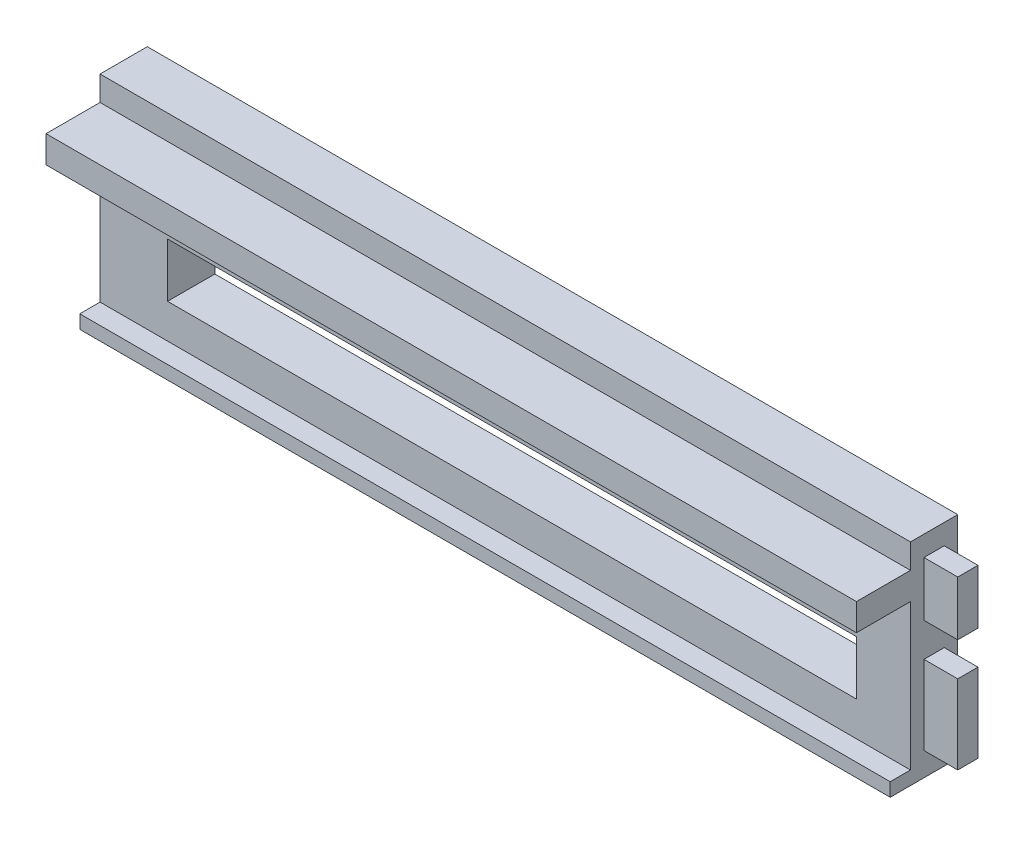
ISO-10303-21;
HEADER;
FILE_DESCRIPTION(('STEP AP214'),'2;1');
FILE_NAME('part.step','',(''),(''),'','','');
FILE_SCHEMA(('AUTOMOTIVE_DESIGN { 1 0 10303 214 1 1 1 1 }'));
ENDSEC;
DATA;
#1=APPLICATION_CONTEXT('core data for automotive mechanical design processes');
#2=APPLICATION_PROTOCOL_DEFINITION('international standard','automotive_design',2000,#1);
#3=PRODUCT_CONTEXT('',#1,'mechanical');
#4=PRODUCT('Part','Part','',(#3));
#5=PRODUCT_RELATED_PRODUCT_CATEGORY('part','',(#4));
#6=PRODUCT_DEFINITION_FORMATION('','',#4);
#7=PRODUCT_DEFINITION_CONTEXT('part definition',#1,'design');
#8=PRODUCT_DEFINITION('design','',#6,#7);
#9=PRODUCT_DEFINITION_SHAPE('','',#8);
#10=(LENGTH_UNIT() NAMED_UNIT(*) SI_UNIT(.MILLI.,.METRE.));
#11=(NAMED_UNIT(*) PLANE_ANGLE_UNIT() SI_UNIT($,.RADIAN.));
#12=(NAMED_UNIT(*) SI_UNIT($,.STERADIAN.) SOLID_ANGLE_UNIT());
#13=UNCERTAINTY_MEASURE_WITH_UNIT(LENGTH_MEASURE(1.E-05),#10,'distance_accuracy_value','');
#14=(GEOMETRIC_REPRESENTATION_CONTEXT(3) GLOBAL_UNCERTAINTY_ASSIGNED_CONTEXT((#13)) GLOBAL_UNIT_ASSIGNED_CONTEXT((#10,
#11,#12)) REPRESENTATION_CONTEXT('',''));
#15=CARTESIAN_POINT('',(0.,0.,0.));
#16=DIRECTION('',(0.,0.,1.));
#17=DIRECTION('',(1.,0.,0.));
#18=AXIS2_PLACEMENT_3D('',#15,#16,#17);
#19=CARTESIAN_POINT('',(120.,0.,7.));
#20=DIRECTION('',(-1.,0.,0.));
#21=DIRECTION('',(0.,0.,1.));
#22=AXIS2_PLACEMENT_3D('',#19,#20,#21);
#23=PLANE('',#22);
#24=DIRECTION('',(0.,-1.,0.));
#25=VECTOR('',#24,1.);
#26=CARTESIAN_POINT('',(120.,3.5,5.));
#27=LINE('',#26,#25);
#28=CARTESIAN_POINT('',(120.,15.1919851003935,5.));
#29=VERTEX_POINT('',#28);
#30=CARTESIAN_POINT('',(120.,3.5,5.));
#31=VERTEX_POINT('',#30);
#32=EDGE_CURVE('E328',#29,#31,#27,.T.);
#33=ORIENTED_EDGE('',*,*,#32,.F.);
#34=DIRECTION('',(0.,0.,1.));
#35=VECTOR('',#34,1.);
#36=CARTESIAN_POINT('',(120.,15.1919851003935,5.));
#37=LINE('',#36,#35);
#38=CARTESIAN_POINT('',(120.,15.1919851003935,2.));
#39=VERTEX_POINT('',#38);
#40=EDGE_CURVE('E317',#39,#29,#37,.T.);
#41=ORIENTED_EDGE('',*,*,#40,.F.);
#42=DIRECTION('',(0.,1.,0.));
#43=VECTOR('',#42,1.);
#44=CARTESIAN_POINT('',(120.,3.5,2.));
#45=LINE('',#44,#43);
#46=CARTESIAN_POINT('',(120.,3.5,2.));
#47=VERTEX_POINT('',#46);
#48=EDGE_CURVE('E318',#47,#39,#45,.T.);
#49=ORIENTED_EDGE('',*,*,#48,.F.);
#50=DIRECTION('',(0.,0.,-1.));
#51=VECTOR('',#50,1.);
#52=CARTESIAN_POINT('',(120.,3.5,5.));
#53=LINE('',#52,#51);
#54=EDGE_CURVE('E323',#31,#47,#53,.T.);
#55=ORIENTED_EDGE('',*,*,#54,.F.);
#56=EDGE_LOOP('',(#33,#41,#49,#55));
#57=FACE_BOUND('',#56,.T.);
#58=DIRECTION('',(0.,1.,0.));
#59=VECTOR('',#58,1.);
#60=CARTESIAN_POINT('',(120.,0.,10.));
#61=LINE('',#60,#59);
#62=CARTESIAN_POINT('',(120.,0.,10.));
#63=VERTEX_POINT('',#62);
#64=CARTESIAN_POINT('',(120.,2.,10.));
#65=VERTEX_POINT('',#64);
#66=EDGE_CURVE('E379',#63,#65,#61,.T.);
#67=ORIENTED_EDGE('',*,*,#66,.F.);
#68=DIRECTION('',(0.,0.,-1.));
#69=VECTOR('',#68,1.);
#70=CARTESIAN_POINT('',(120.,0.,7.));
#71=LINE('',#70,#69);
#72=CARTESIAN_POINT('',(120.,0.,0.));
#73=VERTEX_POINT('',#72);
#74=EDGE_CURVE('E53',#63,#73,#71,.T.);
#75=ORIENTED_EDGE('',*,*,#74,.T.);
#76=DIRECTION('',(0.,1.,0.));
#77=VECTOR('',#76,1.);
#78=CARTESIAN_POINT('',(120.,0.,0.));
#79=LINE('',#78,#77);
#80=CARTESIAN_POINT('',(120.,31.25,0.));
#81=VERTEX_POINT('',#80);
#82=EDGE_CURVE('E596',#73,#81,#79,.T.);
#83=ORIENTED_EDGE('',*,*,#82,.T.);
#84=DIRECTION('',(0.,0.,-1.));
#85=VECTOR('',#84,1.);
#86=CARTESIAN_POINT('',(120.,31.25,7.));
#87=LINE('',#86,#85);
#88=CARTESIAN_POINT('',(120.,31.25,7.));
#89=VERTEX_POINT('',#88);
#90=EDGE_CURVE('E610',#89,#81,#87,.T.);
#91=ORIENTED_EDGE('',*,*,#90,.F.);
#92=DIRECTION('',(0.,1.,0.));
#93=VECTOR('',#92,1.);
#94=CARTESIAN_POINT('',(120.,0.,7.));
#95=LINE('',#94,#93);
#96=CARTESIAN_POINT('',(120.,27.6,7.));
#97=VERTEX_POINT('',#96);
#98=EDGE_CURVE('E585',#97,#89,#95,.T.);
#99=ORIENTED_EDGE('',*,*,#98,.F.);
#100=DIRECTION('',(0.,0.,-1.));
#101=VECTOR('',#100,1.);
#102=CARTESIAN_POINT('',(120.,27.6,15.));
#103=LINE('',#102,#101);
#104=CARTESIAN_POINT('',(120.,27.6,15.));
#105=VERTEX_POINT('',#104);
#106=EDGE_CURVE('E560',#105,#97,#103,.T.);
#107=ORIENTED_EDGE('',*,*,#106,.F.);
#108=DIRECTION('',(0.,1.,0.));
#109=VECTOR('',#108,1.);
#110=CARTESIAN_POINT('',(120.,27.6,15.));
#111=LINE('',#110,#109);
#112=CARTESIAN_POINT('',(120.,23.6,15.));
#113=VERTEX_POINT('',#112);
#114=EDGE_CURVE('E536',#113,#105,#111,.T.);
#115=ORIENTED_EDGE('',*,*,#114,.F.);
#116=DIRECTION('',(0.,0.,-1.));
#117=VECTOR('',#116,1.);
#118=CARTESIAN_POINT('',(120.,23.6,15.));
#119=LINE('',#118,#117);
#120=CARTESIAN_POINT('',(120.,23.6,7.));
#121=VERTEX_POINT('',#120);
#122=EDGE_CURVE('E561',#113,#121,#119,.T.);
#123=ORIENTED_EDGE('',*,*,#122,.T.);
#124=CARTESIAN_POINT('',(120.,2.,7.));
#125=VERTEX_POINT('',#124);
#126=EDGE_CURVE('E586',#125,#121,#95,.T.);
#127=ORIENTED_EDGE('',*,*,#126,.F.);
#128=DIRECTION('',(0.,0.,-1.));
#129=VECTOR('',#128,1.);
#130=CARTESIAN_POINT('',(120.,2.,15.));
#131=LINE('',#130,#129);
#132=EDGE_CURVE('E528',#65,#125,#131,.T.);
#133=ORIENTED_EDGE('',*,*,#132,.F.);
#134=EDGE_LOOP('',(#67,#75,#83,#91,#99,#107,#115,#123,#127,#133));
#135=FACE_BOUND('',#134,.T.);
#136=DIRECTION('',(0.,-1.,0.));
#137=VECTOR('',#136,1.);
#138=CARTESIAN_POINT('',(120.,20.1919851003935,5.));
#139=LINE('',#138,#137);
#140=CARTESIAN_POINT('',(120.,28.25,5.));
#141=VERTEX_POINT('',#140);
#142=CARTESIAN_POINT('',(120.,20.1919851003935,5.));
#143=VERTEX_POINT('',#142);
#144=EDGE_CURVE('E62',#141,#143,#139,.T.);
#145=ORIENTED_EDGE('',*,*,#144,.F.);
#146=DIRECTION('',(0.,0.,1.));
#147=VECTOR('',#146,1.);
#148=CARTESIAN_POINT('',(120.,28.25,5.));
#149=LINE('',#148,#147);
#150=CARTESIAN_POINT('',(120.,28.25,2.));
#151=VERTEX_POINT('',#150);
#152=EDGE_CURVE('E63',#151,#141,#149,.T.);
#153=ORIENTED_EDGE('',*,*,#152,.F.);
#154=DIRECTION('',(0.,1.,0.));
#155=VECTOR('',#154,1.);
#156=CARTESIAN_POINT('',(120.,20.1919851003935,2.));
#157=LINE('',#156,#155);
#158=CARTESIAN_POINT('',(120.,20.1919851003935,2.));
#159=VERTEX_POINT('',#158);
#160=EDGE_CURVE('E1022',#159,#151,#157,.T.);
#161=ORIENTED_EDGE('',*,*,#160,.F.);
#162=DIRECTION('',(0.,0.,-1.));
#163=VECTOR('',#162,1.);
#164=CARTESIAN_POINT('',(120.,20.1919851003935,5.));
#165=LINE('',#164,#163);
#166=EDGE_CURVE('E1031',#143,#159,#165,.T.);
#167=ORIENTED_EDGE('',*,*,#166,.F.);
#168=EDGE_LOOP('',(#145,#153,#161,#167));
#169=FACE_BOUND('',#168,.T.);
#170=ADVANCED_FACE('F44',(#57,#135,#169),#23,.F.);
#171=CARTESIAN_POINT('',(0.,0.,7.));
#172=DIRECTION('',(1.,0.,0.));
#173=DIRECTION('',(0.,0.,-1.));
#174=AXIS2_PLACEMENT_3D('',#171,#172,#173);
#175=PLANE('',#174);
#176=DIRECTION('',(0.,0.,1.));
#177=VECTOR('',#176,1.);
#178=CARTESIAN_POINT('',(0.,20.1593881752143,2.));
#179=LINE('',#178,#177);
#180=CARTESIAN_POINT('',(0.,20.1593881752143,2.));
#181=VERTEX_POINT('',#180);
#182=CARTESIAN_POINT('',(0.,20.1593881752143,5.));
#183=VERTEX_POINT('',#182);
#184=EDGE_CURVE('E362',#181,#183,#179,.T.);
#185=ORIENTED_EDGE('',*,*,#184,.F.);
#186=DIRECTION('',(0.,-1.,0.));
#187=VECTOR('',#186,1.);
#188=CARTESIAN_POINT('',(0.,20.1593881752143,2.));
#189=LINE('',#188,#187);
#190=CARTESIAN_POINT('',(0.,28.25,2.));
#191=VERTEX_POINT('',#190);
#192=EDGE_CURVE('E365',#191,#181,#189,.T.);
#193=ORIENTED_EDGE('',*,*,#192,.F.);
#194=DIRECTION('',(0.,0.,-1.));
#195=VECTOR('',#194,1.);
#196=CARTESIAN_POINT('',(0.,28.25,2.));
#197=LINE('',#196,#195);
#198=CARTESIAN_POINT('',(0.,28.25,5.));
#199=VERTEX_POINT('',#198);
#200=EDGE_CURVE('E348',#199,#191,#197,.T.);
#201=ORIENTED_EDGE('',*,*,#200,.F.);
#202=DIRECTION('',(0.,1.,0.));
#203=VECTOR('',#202,1.);
#204=CARTESIAN_POINT('',(0.,20.1593881752143,5.));
#205=LINE('',#204,#203);
#206=EDGE_CURVE('E369',#183,#199,#205,.T.);
#207=ORIENTED_EDGE('',*,*,#206,.F.);
#208=EDGE_LOOP('',(#185,#193,#201,#207));
#209=FACE_BOUND('',#208,.T.);
#210=DIRECTION('',(0.,0.,1.));
#211=VECTOR('',#210,1.);
#212=CARTESIAN_POINT('',(0.,3.5,2.));
#213=LINE('',#212,#211);
#214=CARTESIAN_POINT('',(0.,3.5,2.));
#215=VERTEX_POINT('',#214);
#216=CARTESIAN_POINT('',(0.,3.5,5.));
#217=VERTEX_POINT('',#216);
#218=EDGE_CURVE('E406',#215,#217,#213,.T.);
#219=ORIENTED_EDGE('',*,*,#218,.F.);
#220=DIRECTION('',(0.,-1.,0.));
#221=VECTOR('',#220,1.);
#222=CARTESIAN_POINT('',(0.,3.5,2.));
#223=LINE('',#222,#221);
#224=CARTESIAN_POINT('',(0.,14.1593881752143,2.));
#225=VERTEX_POINT('',#224);
#226=EDGE_CURVE('E366',#225,#215,#223,.T.);
#227=ORIENTED_EDGE('',*,*,#226,.F.);
#228=DIRECTION('',(0.,0.,-1.));
#229=VECTOR('',#228,1.);
#230=CARTESIAN_POINT('',(0.,14.1593881752143,2.));
#231=LINE('',#230,#229);
#232=CARTESIAN_POINT('',(0.,14.1593881752143,5.));
#233=VERTEX_POINT('',#232);
#234=EDGE_CURVE('E398',#233,#225,#231,.T.);
#235=ORIENTED_EDGE('',*,*,#234,.F.);
#236=DIRECTION('',(0.,1.,0.));
#237=VECTOR('',#236,1.);
#238=CARTESIAN_POINT('',(0.,3.5,5.));
#239=LINE('',#238,#237);
#240=EDGE_CURVE('E404',#217,#233,#239,.T.);
#241=ORIENTED_EDGE('',*,*,#240,.F.);
#242=EDGE_LOOP('',(#219,#227,#235,#241));
#243=FACE_BOUND('',#242,.T.);
#244=DIRECTION('',(0.,-1.,0.));
#245=VECTOR('',#244,1.);
#246=CARTESIAN_POINT('',(0.,0.,10.));
#247=LINE('',#246,#245);
#248=CARTESIAN_POINT('',(0.,2.,10.));
#249=VERTEX_POINT('',#248);
#250=CARTESIAN_POINT('',(0.,0.,10.));
#251=VERTEX_POINT('',#250);
#252=EDGE_CURVE('E431',#249,#251,#247,.T.);
#253=ORIENTED_EDGE('',*,*,#252,.F.);
#254=DIRECTION('',(0.,0.,-1.));
#255=VECTOR('',#254,1.);
#256=CARTESIAN_POINT('',(0.,2.,15.));
#257=LINE('',#256,#255);
#258=CARTESIAN_POINT('',(0.,2.,7.));
#259=VERTEX_POINT('',#258);
#260=EDGE_CURVE('E575',#249,#259,#257,.T.);
#261=ORIENTED_EDGE('',*,*,#260,.T.);
#262=DIRECTION('',(0.,-1.,0.));
#263=VECTOR('',#262,1.);
#264=CARTESIAN_POINT('',(0.,0.,7.));
#265=LINE('',#264,#263);
#266=CARTESIAN_POINT('',(0.,23.6,7.));
#267=VERTEX_POINT('',#266);
#268=EDGE_CURVE('E584',#267,#259,#265,.T.);
#269=ORIENTED_EDGE('',*,*,#268,.F.);
#270=DIRECTION('',(0.,0.,-1.));
#271=VECTOR('',#270,1.);
#272=CARTESIAN_POINT('',(0.,23.6,15.));
#273=LINE('',#272,#271);
#274=CARTESIAN_POINT('',(0.,23.6,15.));
#275=VERTEX_POINT('',#274);
#276=EDGE_CURVE('E564',#275,#267,#273,.T.);
#277=ORIENTED_EDGE('',*,*,#276,.F.);
#278=DIRECTION('',(0.,-1.,0.));
#279=VECTOR('',#278,1.);
#280=CARTESIAN_POINT('',(0.,27.6,15.));
#281=LINE('',#280,#279);
#282=CARTESIAN_POINT('',(0.,27.6,15.));
#283=VERTEX_POINT('',#282);
#284=EDGE_CURVE('E532',#283,#275,#281,.T.);
#285=ORIENTED_EDGE('',*,*,#284,.F.);
#286=DIRECTION('',(0.,0.,-1.));
#287=VECTOR('',#286,1.);
#288=CARTESIAN_POINT('',(0.,27.6,15.));
#289=LINE('',#288,#287);
#290=CARTESIAN_POINT('',(0.,27.6,7.));
#291=VERTEX_POINT('',#290);
#292=EDGE_CURVE('E544',#283,#291,#289,.T.);
#293=ORIENTED_EDGE('',*,*,#292,.T.);
#294=CARTESIAN_POINT('',(0.,31.25,7.));
#295=VERTEX_POINT('',#294);
#296=EDGE_CURVE('E576',#295,#291,#265,.T.);
#297=ORIENTED_EDGE('',*,*,#296,.F.);
#298=DIRECTION('',(0.,0.,-1.));
#299=VECTOR('',#298,1.);
#300=CARTESIAN_POINT('',(0.,31.25,7.));
#301=LINE('',#300,#299);
#302=CARTESIAN_POINT('',(0.,31.25,0.));
#303=VERTEX_POINT('',#302);
#304=EDGE_CURVE('E589',#295,#303,#301,.T.);
#305=ORIENTED_EDGE('',*,*,#304,.T.);
#306=DIRECTION('',(0.,-1.,0.));
#307=VECTOR('',#306,1.);
#308=CARTESIAN_POINT('',(0.,0.,0.));
#309=LINE('',#308,#307);
#310=CARTESIAN_POINT('',(0.,0.,0.));
#311=VERTEX_POINT('',#310);
#312=EDGE_CURVE('E567',#303,#311,#309,.T.);
#313=ORIENTED_EDGE('',*,*,#312,.T.);
#314=DIRECTION('',(0.,0.,-1.));
#315=VECTOR('',#314,1.);
#316=CARTESIAN_POINT('',(0.,0.,7.));
#317=LINE('',#316,#315);
#318=EDGE_CURVE('E11',#251,#311,#317,.T.);
#319=ORIENTED_EDGE('',*,*,#318,.F.);
#320=EDGE_LOOP('',(#253,#261,#269,#277,#285,#293,#297,#305,#313,#319));
#321=FACE_BOUND('',#320,.T.);
#322=ADVANCED_FACE('F50',(#209,#243,#321),#175,.F.);
#323=CARTESIAN_POINT('',(0.,2.,15.));
#324=DIRECTION('',(0.,-1.,0.));
#325=DIRECTION('',(0.,0.,-1.));
#326=AXIS2_PLACEMENT_3D('',#323,#324,#325);
#327=PLANE('',#326);
#328=DIRECTION('',(-1.,0.,0.));
#329=VECTOR('',#328,1.);
#330=CARTESIAN_POINT('',(120.001,2.,10.));
#331=LINE('',#330,#329);
#332=EDGE_CURVE('E432',#65,#249,#331,.T.);
#333=ORIENTED_EDGE('',*,*,#332,.F.);
#334=ORIENTED_EDGE('',*,*,#132,.T.);
#335=DIRECTION('',(-1.,0.,0.));
#336=VECTOR('',#335,1.);
#337=CARTESIAN_POINT('',(0.,2.,7.));
#338=LINE('',#337,#336);
#339=EDGE_CURVE('E574',#125,#259,#338,.T.);
#340=ORIENTED_EDGE('',*,*,#339,.T.);
#341=ORIENTED_EDGE('',*,*,#260,.F.);
#342=EDGE_LOOP('',(#333,#334,#340,#341));
#343=FACE_BOUND('',#342,.T.);
#344=ADVANCED_FACE('F661',(#343),#327,.F.);
#345=CARTESIAN_POINT('',(0.,0.,7.));
#346=DIRECTION('',(0.,0.,-1.));
#347=DIRECTION('',(-1.,0.,0.));
#348=AXIS2_PLACEMENT_3D('',#345,#346,#347);
#349=PLANE('',#348);
#350=DIRECTION('',(-1.,0.,0.));
#351=VECTOR('',#350,1.);
#352=CARTESIAN_POINT('',(0.,27.6,7.));
#353=LINE('',#352,#351);
#354=EDGE_CURVE('E537',#97,#291,#353,.T.);
#355=ORIENTED_EDGE('',*,*,#354,.F.);
#356=ORIENTED_EDGE('',*,*,#98,.T.);
#357=DIRECTION('',(-1.,0.,0.));
#358=VECTOR('',#357,1.);
#359=CARTESIAN_POINT('',(0.,31.25,7.));
#360=LINE('',#359,#358);
#361=EDGE_CURVE('E590',#89,#295,#360,.T.);
#362=ORIENTED_EDGE('',*,*,#361,.T.);
#363=ORIENTED_EDGE('',*,*,#296,.T.);
#364=EDGE_LOOP('',(#355,#356,#362,#363));
#365=FACE_BOUND('',#364,.T.);
#366=ADVANCED_FACE('F634',(#365),#349,.F.);
#367=DIRECTION('',(-1.,0.,0.));
#368=VECTOR('',#367,1.);
#369=CARTESIAN_POINT('',(0.,7.1,7.));
#370=LINE('',#369,#368);
#371=CARTESIAN_POINT('',(112.,7.1,7.));
#372=VERTEX_POINT('',#371);
#373=CARTESIAN_POINT('',(10.,7.1,7.));
#374=VERTEX_POINT('',#373);
#375=EDGE_CURVE('E511',#372,#374,#370,.T.);
#376=ORIENTED_EDGE('',*,*,#375,.T.);
#377=DIRECTION('',(0.,1.,0.));
#378=VECTOR('',#377,1.);
#379=CARTESIAN_POINT('',(10.,0.,7.));
#380=LINE('',#379,#378);
#381=CARTESIAN_POINT('',(10.,15.1,7.));
#382=VERTEX_POINT('',#381);
#383=EDGE_CURVE('E527',#374,#382,#380,.T.);
#384=ORIENTED_EDGE('',*,*,#383,.T.);
#385=DIRECTION('',(1.,0.,0.));
#386=VECTOR('',#385,1.);
#387=CARTESIAN_POINT('',(0.,15.1,7.));
#388=LINE('',#387,#386);
#389=CARTESIAN_POINT('',(112.,15.1,7.));
#390=VERTEX_POINT('',#389);
#391=EDGE_CURVE('E525',#382,#390,#388,.T.);
#392=ORIENTED_EDGE('',*,*,#391,.T.);
#393=DIRECTION('',(0.,-1.,0.));
#394=VECTOR('',#393,1.);
#395=CARTESIAN_POINT('',(112.,0.,7.));
#396=LINE('',#395,#394);
#397=EDGE_CURVE('E519',#390,#372,#396,.T.);
#398=ORIENTED_EDGE('',*,*,#397,.T.);
#399=EDGE_LOOP('',(#376,#384,#392,#398));
#400=FACE_BOUND('',#399,.T.);
#401=DIRECTION('',(-1.,0.,0.));
#402=VECTOR('',#401,1.);
#403=CARTESIAN_POINT('',(0.,20.1,7.));
#404=LINE('',#403,#402);
#405=CARTESIAN_POINT('',(112.,20.1,7.));
#406=VERTEX_POINT('',#405);
#407=CARTESIAN_POINT('',(10.,20.1,7.));
#408=VERTEX_POINT('',#407);
#409=EDGE_CURVE('E461',#406,#408,#404,.T.);
#410=ORIENTED_EDGE('',*,*,#409,.T.);
#411=DIRECTION('',(0.,1.,0.));
#412=VECTOR('',#411,1.);
#413=CARTESIAN_POINT('',(10.,0.,7.));
#414=LINE('',#413,#412);
#415=CARTESIAN_POINT('',(10.,23.6,7.));
#416=VERTEX_POINT('',#415);
#417=EDGE_CURVE('E509',#408,#416,#414,.T.);
#418=ORIENTED_EDGE('',*,*,#417,.T.);
#419=DIRECTION('',(1.,0.,0.));
#420=VECTOR('',#419,1.);
#421=CARTESIAN_POINT('',(0.,23.6,7.));
#422=LINE('',#421,#420);
#423=EDGE_CURVE('E547',#267,#416,#422,.T.);
#424=ORIENTED_EDGE('',*,*,#423,.F.);
#425=ORIENTED_EDGE('',*,*,#268,.T.);
#426=ORIENTED_EDGE('',*,*,#339,.F.);
#427=ORIENTED_EDGE('',*,*,#126,.T.);
#428=CARTESIAN_POINT('',(112.,23.6,7.));
#429=VERTEX_POINT('',#428);
#430=EDGE_CURVE('E548',#429,#121,#422,.T.);
#431=ORIENTED_EDGE('',*,*,#430,.F.);
#432=DIRECTION('',(0.,-1.,0.));
#433=VECTOR('',#432,1.);
#434=CARTESIAN_POINT('',(112.,0.,7.));
#435=LINE('',#434,#433);
#436=EDGE_CURVE('E506',#429,#406,#435,.T.);
#437=ORIENTED_EDGE('',*,*,#436,.T.);
#438=EDGE_LOOP('',(#410,#418,#424,#425,#426,#427,#431,#437));
#439=FACE_BOUND('',#438,.T.);
#440=ADVANCED_FACE('F654',(#400,#439),#349,.F.);
#441=CARTESIAN_POINT('',(0.,0.,7.));
#442=DIRECTION('',(0.,1.,0.));
#443=DIRECTION('',(0.,0.,1.));
#444=AXIS2_PLACEMENT_3D('',#441,#442,#443);
#445=PLANE('',#444);
#446=ORIENTED_EDGE('',*,*,#74,.F.);
#447=DIRECTION('',(-1.,0.,0.));
#448=VECTOR('',#447,1.);
#449=CARTESIAN_POINT('',(120.001,0.,10.));
#450=LINE('',#449,#448);
#451=EDGE_CURVE('E434',#63,#251,#450,.T.);
#452=ORIENTED_EDGE('',*,*,#451,.T.);
#453=ORIENTED_EDGE('',*,*,#318,.T.);
#454=DIRECTION('',(1.,0.,0.));
#455=VECTOR('',#454,1.);
#456=CARTESIAN_POINT('',(0.,0.,0.));
#457=LINE('',#456,#455);
#458=EDGE_CURVE('E591',#311,#73,#457,.T.);
#459=ORIENTED_EDGE('',*,*,#458,.T.);
#460=EDGE_LOOP('',(#446,#452,#453,#459));
#461=FACE_BOUND('',#460,.T.);
#462=ADVANCED_FACE('F620',(#461),#445,.F.);
#463=CARTESIAN_POINT('',(0.,31.25,7.));
#464=DIRECTION('',(0.,-1.,0.));
#465=DIRECTION('',(0.,0.,-1.));
#466=AXIS2_PLACEMENT_3D('',#463,#464,#465);
#467=PLANE('',#466);
#468=DIRECTION('',(-1.,0.,0.));
#469=VECTOR('',#468,1.);
#470=CARTESIAN_POINT('',(0.,31.25,0.));
#471=LINE('',#470,#469);
#472=EDGE_CURVE('E602',#81,#303,#471,.T.);
#473=ORIENTED_EDGE('',*,*,#472,.T.);
#474=ORIENTED_EDGE('',*,*,#304,.F.);
#475=ORIENTED_EDGE('',*,*,#361,.F.);
#476=ORIENTED_EDGE('',*,*,#90,.T.);
#477=EDGE_LOOP('',(#473,#474,#475,#476));
#478=FACE_BOUND('',#477,.T.);
#479=ADVANCED_FACE('F630',(#478),#467,.F.);
#480=CARTESIAN_POINT('',(0.,0.,0.));
#481=DIRECTION('',(0.,0.,-1.));
#482=DIRECTION('',(-1.,0.,0.));
#483=AXIS2_PLACEMENT_3D('',#480,#481,#482);
#484=PLANE('',#483);
#485=DIRECTION('',(0.,-1.,0.));
#486=VECTOR('',#485,1.);
#487=CARTESIAN_POINT('',(10.,7.1,0.));
#488=LINE('',#487,#486);
#489=CARTESIAN_POINT('',(10.,15.1,0.));
#490=VERTEX_POINT('',#489);
#491=CARTESIAN_POINT('',(10.,7.1,0.));
#492=VERTEX_POINT('',#491);
#493=EDGE_CURVE('E445',#490,#492,#488,.T.);
#494=ORIENTED_EDGE('',*,*,#493,.T.);
#495=DIRECTION('',(1.,0.,0.));
#496=VECTOR('',#495,1.);
#497=CARTESIAN_POINT('',(10.,7.1,0.));
#498=LINE('',#497,#496);
#499=CARTESIAN_POINT('',(112.,7.1,0.));
#500=VERTEX_POINT('',#499);
#501=EDGE_CURVE('E447',#492,#500,#498,.T.);
#502=ORIENTED_EDGE('',*,*,#501,.T.);
#503=DIRECTION('',(0.,1.,0.));
#504=VECTOR('',#503,1.);
#505=CARTESIAN_POINT('',(112.,7.1,0.));
#506=LINE('',#505,#504);
#507=CARTESIAN_POINT('',(112.,15.1,0.));
#508=VERTEX_POINT('',#507);
#509=EDGE_CURVE('E452',#500,#508,#506,.T.);
#510=ORIENTED_EDGE('',*,*,#509,.T.);
#511=DIRECTION('',(-1.,0.,0.));
#512=VECTOR('',#511,1.);
#513=CARTESIAN_POINT('',(10.,15.1,0.));
#514=LINE('',#513,#512);
#515=EDGE_CURVE('E453',#508,#490,#514,.T.);
#516=ORIENTED_EDGE('',*,*,#515,.T.);
#517=EDGE_LOOP('',(#494,#502,#510,#516));
#518=FACE_BOUND('',#517,.T.);
#519=DIRECTION('',(0.,-1.,0.));
#520=VECTOR('',#519,1.);
#521=CARTESIAN_POINT('',(10.,20.1,0.));
#522=LINE('',#521,#520);
#523=CARTESIAN_POINT('',(10.,23.6,0.));
#524=VERTEX_POINT('',#523);
#525=CARTESIAN_POINT('',(10.,20.1,0.));
#526=VERTEX_POINT('',#525);
#527=EDGE_CURVE('E450',#524,#526,#522,.T.);
#528=ORIENTED_EDGE('',*,*,#527,.T.);
#529=DIRECTION('',(1.,0.,0.));
#530=VECTOR('',#529,1.);
#531=CARTESIAN_POINT('',(10.,20.1,0.));
#532=LINE('',#531,#530);
#533=CARTESIAN_POINT('',(112.,20.1,0.));
#534=VERTEX_POINT('',#533);
#535=EDGE_CURVE('E496',#526,#534,#532,.T.);
#536=ORIENTED_EDGE('',*,*,#535,.T.);
#537=DIRECTION('',(0.,1.,0.));
#538=VECTOR('',#537,1.);
#539=CARTESIAN_POINT('',(112.,20.1,0.));
#540=LINE('',#539,#538);
#541=CARTESIAN_POINT('',(112.,23.6,0.));
#542=VERTEX_POINT('',#541);
#543=EDGE_CURVE('E495',#534,#542,#540,.T.);
#544=ORIENTED_EDGE('',*,*,#543,.T.);
#545=DIRECTION('',(-1.,0.,0.));
#546=VECTOR('',#545,1.);
#547=CARTESIAN_POINT('',(10.,23.6,0.));
#548=LINE('',#547,#546);
#549=EDGE_CURVE('E477',#542,#524,#548,.T.);
#550=ORIENTED_EDGE('',*,*,#549,.T.);
#551=EDGE_LOOP('',(#528,#536,#544,#550));
#552=FACE_BOUND('',#551,.T.);
#553=ORIENTED_EDGE('',*,*,#312,.F.);
#554=ORIENTED_EDGE('',*,*,#472,.F.);
#555=ORIENTED_EDGE('',*,*,#82,.F.);
#556=ORIENTED_EDGE('',*,*,#458,.F.);
#557=EDGE_LOOP('',(#553,#554,#555,#556));
#558=FACE_BOUND('',#557,.T.);
#559=ADVANCED_FACE('F624',(#518,#552,#558),#484,.T.);
#560=CARTESIAN_POINT('',(0.,23.6,15.));
#561=DIRECTION('',(0.,1.,0.));
#562=DIRECTION('',(0.,0.,1.));
#563=AXIS2_PLACEMENT_3D('',#560,#561,#562);
#564=PLANE('',#563);
#565=ORIENTED_EDGE('',*,*,#423,.T.);
#566=DIRECTION('',(0.,0.,1.));
#567=VECTOR('',#566,1.);
#568=CARTESIAN_POINT('',(10.,23.6,0.));
#569=LINE('',#568,#567);
#570=EDGE_CURVE('E437',#524,#416,#569,.T.);
#571=ORIENTED_EDGE('',*,*,#570,.F.);
#572=ORIENTED_EDGE('',*,*,#549,.F.);
#573=DIRECTION('',(0.,0.,1.));
#574=VECTOR('',#573,1.);
#575=CARTESIAN_POINT('',(112.,23.6,0.));
#576=LINE('',#575,#574);
#577=EDGE_CURVE('E485',#542,#429,#576,.T.);
#578=ORIENTED_EDGE('',*,*,#577,.T.);
#579=ORIENTED_EDGE('',*,*,#430,.T.);
#580=ORIENTED_EDGE('',*,*,#122,.F.);
#581=DIRECTION('',(1.,0.,0.));
#582=VECTOR('',#581,1.);
#583=CARTESIAN_POINT('',(0.,23.6,15.));
#584=LINE('',#583,#582);
#585=EDGE_CURVE('E533',#275,#113,#584,.T.);
#586=ORIENTED_EDGE('',*,*,#585,.F.);
#587=ORIENTED_EDGE('',*,*,#276,.T.);
#588=EDGE_LOOP('',(#565,#571,#572,#578,#579,#580,#586,#587));
#589=FACE_BOUND('',#588,.T.);
#590=ADVANCED_FACE('F649',(#589),#564,.F.);
#591=CARTESIAN_POINT('',(0.,27.6,15.));
#592=DIRECTION('',(0.,-1.,0.));
#593=DIRECTION('',(0.,0.,-1.));
#594=AXIS2_PLACEMENT_3D('',#591,#592,#593);
#595=PLANE('',#594);
#596=ORIENTED_EDGE('',*,*,#354,.T.);
#597=ORIENTED_EDGE('',*,*,#292,.F.);
#598=DIRECTION('',(-1.,0.,0.));
#599=VECTOR('',#598,1.);
#600=CARTESIAN_POINT('',(0.,27.6,15.));
#601=LINE('',#600,#599);
#602=EDGE_CURVE('E545',#105,#283,#601,.T.);
#603=ORIENTED_EDGE('',*,*,#602,.F.);
#604=ORIENTED_EDGE('',*,*,#106,.T.);
#605=EDGE_LOOP('',(#596,#597,#603,#604));
#606=FACE_BOUND('',#605,.T.);
#607=ADVANCED_FACE('F637',(#606),#595,.F.);
#608=CARTESIAN_POINT('',(0.,0.,15.));
#609=DIRECTION('',(0.,0.,1.));
#610=DIRECTION('',(1.,0.,0.));
#611=AXIS2_PLACEMENT_3D('',#608,#609,#610);
#612=PLANE('',#611);
#613=ORIENTED_EDGE('',*,*,#284,.T.);
#614=ORIENTED_EDGE('',*,*,#585,.T.);
#615=ORIENTED_EDGE('',*,*,#114,.T.);
#616=ORIENTED_EDGE('',*,*,#602,.T.);
#617=EDGE_LOOP('',(#613,#614,#615,#616));
#618=FACE_BOUND('',#617,.T.);
#619=ADVANCED_FACE('F643',(#618),#612,.T.);
#620=CARTESIAN_POINT('',(10.,20.1,0.));
#621=DIRECTION('',(-1.,0.,0.));
#622=DIRECTION('',(0.,0.,1.));
#623=AXIS2_PLACEMENT_3D('',#620,#621,#622);
#624=PLANE('',#623);
#625=DIRECTION('',(0.,0.,1.));
#626=VECTOR('',#625,1.);
#627=CARTESIAN_POINT('',(10.,20.1,0.));
#628=LINE('',#627,#626);
#629=EDGE_CURVE('E473',#526,#408,#628,.T.);
#630=ORIENTED_EDGE('',*,*,#629,.F.);
#631=ORIENTED_EDGE('',*,*,#527,.F.);
#632=ORIENTED_EDGE('',*,*,#570,.T.);
#633=ORIENTED_EDGE('',*,*,#417,.F.);
#634=EDGE_LOOP('',(#630,#631,#632,#633));
#635=FACE_BOUND('',#634,.T.);
#636=ADVANCED_FACE('F720',(#635),#624,.F.);
#637=CARTESIAN_POINT('',(112.,20.1,0.));
#638=DIRECTION('',(1.,0.,0.));
#639=DIRECTION('',(0.,0.,-1.));
#640=AXIS2_PLACEMENT_3D('',#637,#638,#639);
#641=PLANE('',#640);
#642=ORIENTED_EDGE('',*,*,#577,.F.);
#643=ORIENTED_EDGE('',*,*,#543,.F.);
#644=DIRECTION('',(0.,0.,1.));
#645=VECTOR('',#644,1.);
#646=CARTESIAN_POINT('',(112.,20.1,0.));
#647=LINE('',#646,#645);
#648=EDGE_CURVE('E478',#534,#406,#647,.T.);
#649=ORIENTED_EDGE('',*,*,#648,.T.);
#650=ORIENTED_EDGE('',*,*,#436,.F.);
#651=EDGE_LOOP('',(#642,#643,#649,#650));
#652=FACE_BOUND('',#651,.T.);
#653=ADVANCED_FACE('F725',(#652),#641,.F.);
#654=CARTESIAN_POINT('',(10.,20.1,0.));
#655=DIRECTION('',(0.,-1.,0.));
#656=DIRECTION('',(0.,0.,-1.));
#657=AXIS2_PLACEMENT_3D('',#654,#655,#656);
#658=PLANE('',#657);
#659=ORIENTED_EDGE('',*,*,#648,.F.);
#660=ORIENTED_EDGE('',*,*,#535,.F.);
#661=ORIENTED_EDGE('',*,*,#629,.T.);
#662=ORIENTED_EDGE('',*,*,#409,.F.);
#663=EDGE_LOOP('',(#659,#660,#661,#662));
#664=FACE_BOUND('',#663,.T.);
#665=ADVANCED_FACE('F722',(#664),#658,.F.);
#666=CARTESIAN_POINT('',(10.,7.1,0.));
#667=DIRECTION('',(-1.,0.,0.));
#668=DIRECTION('',(0.,0.,1.));
#669=AXIS2_PLACEMENT_3D('',#666,#667,#668);
#670=PLANE('',#669);
#671=DIRECTION('',(0.,0.,1.));
#672=VECTOR('',#671,1.);
#673=CARTESIAN_POINT('',(10.,7.1,0.));
#674=LINE('',#673,#672);
#675=EDGE_CURVE('E458',#492,#374,#674,.T.);
#676=ORIENTED_EDGE('',*,*,#675,.F.);
#677=ORIENTED_EDGE('',*,*,#493,.F.);
#678=DIRECTION('',(0.,0.,1.));
#679=VECTOR('',#678,1.);
#680=CARTESIAN_POINT('',(10.,15.1,0.));
#681=LINE('',#680,#679);
#682=EDGE_CURVE('E459',#490,#382,#681,.T.);
#683=ORIENTED_EDGE('',*,*,#682,.T.);
#684=ORIENTED_EDGE('',*,*,#383,.F.);
#685=EDGE_LOOP('',(#676,#677,#683,#684));
#686=FACE_BOUND('',#685,.T.);
#687=ADVANCED_FACE('F728',(#686),#670,.F.);
#688=CARTESIAN_POINT('',(10.,15.1,0.));
#689=DIRECTION('',(0.,1.,0.));
#690=DIRECTION('',(0.,0.,1.));
#691=AXIS2_PLACEMENT_3D('',#688,#689,#690);
#692=PLANE('',#691);
#693=ORIENTED_EDGE('',*,*,#682,.F.);
#694=ORIENTED_EDGE('',*,*,#515,.F.);
#695=DIRECTION('',(0.,0.,1.));
#696=VECTOR('',#695,1.);
#697=CARTESIAN_POINT('',(112.,15.1,0.));
#698=LINE('',#697,#696);
#699=EDGE_CURVE('E463',#508,#390,#698,.T.);
#700=ORIENTED_EDGE('',*,*,#699,.T.);
#701=ORIENTED_EDGE('',*,*,#391,.F.);
#702=EDGE_LOOP('',(#693,#694,#700,#701));
#703=FACE_BOUND('',#702,.T.);
#704=ADVANCED_FACE('F797',(#703),#692,.F.);
#705=CARTESIAN_POINT('',(112.,7.1,0.));
#706=DIRECTION('',(1.,0.,0.));
#707=DIRECTION('',(0.,0.,-1.));
#708=AXIS2_PLACEMENT_3D('',#705,#706,#707);
#709=PLANE('',#708);
#710=ORIENTED_EDGE('',*,*,#699,.F.);
#711=ORIENTED_EDGE('',*,*,#509,.F.);
#712=DIRECTION('',(0.,0.,1.));
#713=VECTOR('',#712,1.);
#714=CARTESIAN_POINT('',(112.,7.1,0.));
#715=LINE('',#714,#713);
#716=EDGE_CURVE('E469',#500,#372,#715,.T.);
#717=ORIENTED_EDGE('',*,*,#716,.T.);
#718=ORIENTED_EDGE('',*,*,#397,.F.);
#719=EDGE_LOOP('',(#710,#711,#717,#718));
#720=FACE_BOUND('',#719,.T.);
#721=ADVANCED_FACE('F676',(#720),#709,.F.);
#722=CARTESIAN_POINT('',(10.,7.1,0.));
#723=DIRECTION('',(0.,-1.,0.));
#724=DIRECTION('',(0.,0.,-1.));
#725=AXIS2_PLACEMENT_3D('',#722,#723,#724);
#726=PLANE('',#725);
#727=ORIENTED_EDGE('',*,*,#716,.F.);
#728=ORIENTED_EDGE('',*,*,#501,.F.);
#729=ORIENTED_EDGE('',*,*,#675,.T.);
#730=ORIENTED_EDGE('',*,*,#375,.F.);
#731=EDGE_LOOP('',(#727,#728,#729,#730));
#732=FACE_BOUND('',#731,.T.);
#733=ADVANCED_FACE('F669',(#732),#726,.F.);
#734=CARTESIAN_POINT('',(120.001,0.,10.));
#735=DIRECTION('',(0.,0.,-1.));
#736=DIRECTION('',(-1.,0.,0.));
#737=AXIS2_PLACEMENT_3D('',#734,#735,#736);
#738=PLANE('',#737);
#739=ORIENTED_EDGE('',*,*,#66,.T.);
#740=ORIENTED_EDGE('',*,*,#332,.T.);
#741=ORIENTED_EDGE('',*,*,#252,.T.);
#742=ORIENTED_EDGE('',*,*,#451,.F.);
#743=EDGE_LOOP('',(#739,#740,#741,#742));
#744=FACE_BOUND('',#743,.T.);
#745=ADVANCED_FACE('F663',(#744),#738,.F.);
#746=CARTESIAN_POINT('',(5.,3.5,2.));
#747=DIRECTION('',(0.,0.,-1.));
#748=DIRECTION('',(-1.,0.,0.));
#749=AXIS2_PLACEMENT_3D('',#746,#747,#748);
#750=PLANE('',#749);
#751=ORIENTED_EDGE('',*,*,#226,.T.);
#752=DIRECTION('',(-1.,0.,0.));
#753=VECTOR('',#752,1.);
#754=CARTESIAN_POINT('',(5.,3.5,2.));
#755=LINE('',#754,#753);
#756=CARTESIAN_POINT('',(5.,3.5,2.));
#757=VERTEX_POINT('',#756);
#758=EDGE_CURVE('E388',#757,#215,#755,.T.);
#759=ORIENTED_EDGE('',*,*,#758,.F.);
#760=DIRECTION('',(0.,-1.,0.));
#761=VECTOR('',#760,1.);
#762=CARTESIAN_POINT('',(5.,3.5,2.));
#763=LINE('',#762,#761);
#764=CARTESIAN_POINT('',(5.,14.1593881752143,2.));
#765=VERTEX_POINT('',#764);
#766=EDGE_CURVE('E403',#765,#757,#763,.T.);
#767=ORIENTED_EDGE('',*,*,#766,.F.);
#768=DIRECTION('',(-1.,0.,0.));
#769=VECTOR('',#768,1.);
#770=CARTESIAN_POINT('',(5.,14.1593881752143,2.));
#771=LINE('',#770,#769);
#772=EDGE_CURVE('E286',#765,#225,#771,.T.);
#773=ORIENTED_EDGE('',*,*,#772,.T.);
#774=EDGE_LOOP('',(#751,#759,#767,#773));
#775=FACE_BOUND('',#774,.T.);
#776=ADVANCED_FACE('F670',(#775),#750,.F.);
#777=CARTESIAN_POINT('',(5.,14.1593881752143,2.));
#778=DIRECTION('',(0.,1.,0.));
#779=DIRECTION('',(0.,0.,1.));
#780=AXIS2_PLACEMENT_3D('',#777,#778,#779);
#781=PLANE('',#780);
#782=ORIENTED_EDGE('',*,*,#234,.T.);
#783=ORIENTED_EDGE('',*,*,#772,.F.);
#784=DIRECTION('',(0.,0.,-1.));
#785=VECTOR('',#784,1.);
#786=CARTESIAN_POINT('',(5.,14.1593881752143,2.));
#787=LINE('',#786,#785);
#788=CARTESIAN_POINT('',(5.,14.1593881752143,5.));
#789=VERTEX_POINT('',#788);
#790=EDGE_CURVE('E393',#789,#765,#787,.T.);
#791=ORIENTED_EDGE('',*,*,#790,.F.);
#792=DIRECTION('',(-1.,0.,0.));
#793=VECTOR('',#792,1.);
#794=CARTESIAN_POINT('',(5.,14.1593881752143,5.));
#795=LINE('',#794,#793);
#796=EDGE_CURVE('E291',#789,#233,#795,.T.);
#797=ORIENTED_EDGE('',*,*,#796,.T.);
#798=EDGE_LOOP('',(#782,#783,#791,#797));
#799=FACE_BOUND('',#798,.T.);
#800=ADVANCED_FACE('F674',(#799),#781,.F.);
#801=CARTESIAN_POINT('',(5.,3.5,5.));
#802=DIRECTION('',(0.,0.,1.));
#803=DIRECTION('',(1.,0.,0.));
#804=AXIS2_PLACEMENT_3D('',#801,#802,#803);
#805=PLANE('',#804);
#806=ORIENTED_EDGE('',*,*,#240,.T.);
#807=ORIENTED_EDGE('',*,*,#796,.F.);
#808=DIRECTION('',(0.,1.,0.));
#809=VECTOR('',#808,1.);
#810=CARTESIAN_POINT('',(5.,3.5,5.));
#811=LINE('',#810,#809);
#812=CARTESIAN_POINT('',(5.,3.5,5.));
#813=VERTEX_POINT('',#812);
#814=EDGE_CURVE('E420',#813,#789,#811,.T.);
#815=ORIENTED_EDGE('',*,*,#814,.F.);
#816=DIRECTION('',(-1.,0.,0.));
#817=VECTOR('',#816,1.);
#818=CARTESIAN_POINT('',(5.,3.5,5.));
#819=LINE('',#818,#817);
#820=EDGE_CURVE('E394',#813,#217,#819,.T.);
#821=ORIENTED_EDGE('',*,*,#820,.T.);
#822=EDGE_LOOP('',(#806,#807,#815,#821));
#823=FACE_BOUND('',#822,.T.);
#824=ADVANCED_FACE('F847',(#823),#805,.F.);
#825=CARTESIAN_POINT('',(5.,3.5,2.));
#826=DIRECTION('',(0.,-1.,0.));
#827=DIRECTION('',(0.,0.,-1.));
#828=AXIS2_PLACEMENT_3D('',#825,#826,#827);
#829=PLANE('',#828);
#830=ORIENTED_EDGE('',*,*,#218,.T.);
#831=ORIENTED_EDGE('',*,*,#820,.F.);
#832=DIRECTION('',(0.,0.,1.));
#833=VECTOR('',#832,1.);
#834=CARTESIAN_POINT('',(5.,3.5,2.));
#835=LINE('',#834,#833);
#836=EDGE_CURVE('E422',#757,#813,#835,.T.);
#837=ORIENTED_EDGE('',*,*,#836,.F.);
#838=ORIENTED_EDGE('',*,*,#758,.T.);
#839=EDGE_LOOP('',(#830,#831,#837,#838));
#840=FACE_BOUND('',#839,.T.);
#841=ADVANCED_FACE('F860',(#840),#829,.F.);
#842=CARTESIAN_POINT('',(5.,0.,0.));
#843=DIRECTION('',(1.,0.,0.));
#844=DIRECTION('',(0.,0.,-1.));
#845=AXIS2_PLACEMENT_3D('',#842,#843,#844);
#846=PLANE('',#845);
#847=ORIENTED_EDGE('',*,*,#766,.T.);
#848=ORIENTED_EDGE('',*,*,#836,.T.);
#849=ORIENTED_EDGE('',*,*,#814,.T.);
#850=ORIENTED_EDGE('',*,*,#790,.T.);
#851=EDGE_LOOP('',(#847,#848,#849,#850));
#852=FACE_BOUND('',#851,.T.);
#853=ADVANCED_FACE('F866',(#852),#846,.F.);
#854=CARTESIAN_POINT('',(5.,20.1593881752143,2.));
#855=DIRECTION('',(0.,0.,-1.));
#856=DIRECTION('',(-1.,0.,0.));
#857=AXIS2_PLACEMENT_3D('',#854,#855,#856);
#858=PLANE('',#857);
#859=ORIENTED_EDGE('',*,*,#192,.T.);
#860=DIRECTION('',(-1.,0.,0.));
#861=VECTOR('',#860,1.);
#862=CARTESIAN_POINT('',(5.,20.1593881752143,2.));
#863=LINE('',#862,#861);
#864=CARTESIAN_POINT('',(5.,20.1593881752143,2.));
#865=VERTEX_POINT('',#864);
#866=EDGE_CURVE('E363',#865,#181,#863,.T.);
#867=ORIENTED_EDGE('',*,*,#866,.F.);
#868=DIRECTION('',(0.,-1.,0.));
#869=VECTOR('',#868,1.);
#870=CARTESIAN_POINT('',(5.,20.1593881752143,2.));
#871=LINE('',#870,#869);
#872=CARTESIAN_POINT('',(5.,28.25,2.));
#873=VERTEX_POINT('',#872);
#874=EDGE_CURVE('E341',#873,#865,#871,.T.);
#875=ORIENTED_EDGE('',*,*,#874,.F.);
#876=DIRECTION('',(-1.,0.,0.));
#877=VECTOR('',#876,1.);
#878=CARTESIAN_POINT('',(5.,28.25,2.));
#879=LINE('',#878,#877);
#880=EDGE_CURVE('E380',#873,#191,#879,.T.);
#881=ORIENTED_EDGE('',*,*,#880,.T.);
#882=EDGE_LOOP('',(#859,#867,#875,#881));
#883=FACE_BOUND('',#882,.T.);
#884=ADVANCED_FACE('F873',(#883),#858,.F.);
#885=CARTESIAN_POINT('',(5.,28.25,2.));
#886=DIRECTION('',(0.,1.,0.));
#887=DIRECTION('',(0.,0.,1.));
#888=AXIS2_PLACEMENT_3D('',#885,#886,#887);
#889=PLANE('',#888);
#890=ORIENTED_EDGE('',*,*,#200,.T.);
#891=ORIENTED_EDGE('',*,*,#880,.F.);
#892=DIRECTION('',(0.,0.,-1.));
#893=VECTOR('',#892,1.);
#894=CARTESIAN_POINT('',(5.,28.25,2.));
#895=LINE('',#894,#893);
#896=CARTESIAN_POINT('',(5.,28.25,5.));
#897=VERTEX_POINT('',#896);
#898=EDGE_CURVE('E357',#897,#873,#895,.T.);
#899=ORIENTED_EDGE('',*,*,#898,.F.);
#900=DIRECTION('',(-1.,0.,0.));
#901=VECTOR('',#900,1.);
#902=CARTESIAN_POINT('',(5.,28.25,5.));
#903=LINE('',#902,#901);
#904=EDGE_CURVE('E382',#897,#199,#903,.T.);
#905=ORIENTED_EDGE('',*,*,#904,.T.);
#906=EDGE_LOOP('',(#890,#891,#899,#905));
#907=FACE_BOUND('',#906,.T.);
#908=ADVANCED_FACE('F881',(#907),#889,.F.);
#909=CARTESIAN_POINT('',(5.,20.1593881752143,5.));
#910=DIRECTION('',(0.,0.,1.));
#911=DIRECTION('',(1.,0.,0.));
#912=AXIS2_PLACEMENT_3D('',#909,#910,#911);
#913=PLANE('',#912);
#914=ORIENTED_EDGE('',*,*,#206,.T.);
#915=ORIENTED_EDGE('',*,*,#904,.F.);
#916=DIRECTION('',(0.,1.,0.));
#917=VECTOR('',#916,1.);
#918=CARTESIAN_POINT('',(5.,20.1593881752143,5.));
#919=LINE('',#918,#917);
#920=CARTESIAN_POINT('',(5.,20.1593881752143,5.));
#921=VERTEX_POINT('',#920);
#922=EDGE_CURVE('E355',#921,#897,#919,.T.);
#923=ORIENTED_EDGE('',*,*,#922,.F.);
#924=DIRECTION('',(-1.,0.,0.));
#925=VECTOR('',#924,1.);
#926=CARTESIAN_POINT('',(5.,20.1593881752143,5.));
#927=LINE('',#926,#925);
#928=EDGE_CURVE('E381',#921,#183,#927,.T.);
#929=ORIENTED_EDGE('',*,*,#928,.T.);
#930=EDGE_LOOP('',(#914,#915,#923,#929));
#931=FACE_BOUND('',#930,.T.);
#932=ADVANCED_FACE('F895',(#931),#913,.F.);
#933=CARTESIAN_POINT('',(5.,20.1593881752143,2.));
#934=DIRECTION('',(0.,-1.,0.));
#935=DIRECTION('',(0.,0.,-1.));
#936=AXIS2_PLACEMENT_3D('',#933,#934,#935);
#937=PLANE('',#936);
#938=ORIENTED_EDGE('',*,*,#184,.T.);
#939=ORIENTED_EDGE('',*,*,#928,.F.);
#940=DIRECTION('',(0.,0.,1.));
#941=VECTOR('',#940,1.);
#942=CARTESIAN_POINT('',(5.,20.1593881752143,2.));
#943=LINE('',#942,#941);
#944=EDGE_CURVE('E347',#865,#921,#943,.T.);
#945=ORIENTED_EDGE('',*,*,#944,.F.);
#946=ORIENTED_EDGE('',*,*,#866,.T.);
#947=EDGE_LOOP('',(#938,#939,#945,#946));
#948=FACE_BOUND('',#947,.T.);
#949=ADVANCED_FACE('F902',(#948),#937,.F.);
#950=CARTESIAN_POINT('',(5.,0.,0.));
#951=DIRECTION('',(1.,0.,0.));
#952=DIRECTION('',(0.,0.,-1.));
#953=AXIS2_PLACEMENT_3D('',#950,#951,#952);
#954=PLANE('',#953);
#955=ORIENTED_EDGE('',*,*,#874,.T.);
#956=ORIENTED_EDGE('',*,*,#944,.T.);
#957=ORIENTED_EDGE('',*,*,#922,.T.);
#958=ORIENTED_EDGE('',*,*,#898,.T.);
#959=EDGE_LOOP('',(#955,#956,#957,#958));
#960=FACE_BOUND('',#959,.T.);
#961=ADVANCED_FACE('F908',(#960),#954,.F.);
#962=CARTESIAN_POINT('',(125.,3.5,5.));
#963=DIRECTION('',(0.,0.,-1.));
#964=DIRECTION('',(-1.,0.,0.));
#965=AXIS2_PLACEMENT_3D('',#962,#963,#964);
#966=PLANE('',#965);
#967=ORIENTED_EDGE('',*,*,#32,.T.);
#968=DIRECTION('',(-1.,0.,0.));
#969=VECTOR('',#968,1.);
#970=CARTESIAN_POINT('',(125.,3.5,5.));
#971=LINE('',#970,#969);
#972=CARTESIAN_POINT('',(125.,3.5,5.));
#973=VERTEX_POINT('',#972);
#974=EDGE_CURVE('E299',#973,#31,#971,.T.);
#975=ORIENTED_EDGE('',*,*,#974,.F.);
#976=DIRECTION('',(0.,-1.,0.));
#977=VECTOR('',#976,1.);
#978=CARTESIAN_POINT('',(125.,3.5,5.));
#979=LINE('',#978,#977);
#980=CARTESIAN_POINT('',(125.,15.1919851003935,5.));
#981=VERTEX_POINT('',#980);
#982=EDGE_CURVE('E322',#981,#973,#979,.T.);
#983=ORIENTED_EDGE('',*,*,#982,.F.);
#984=DIRECTION('',(-1.,0.,0.));
#985=VECTOR('',#984,1.);
#986=CARTESIAN_POINT('',(125.,15.1919851003935,5.));
#987=LINE('',#986,#985);
#988=EDGE_CURVE('E311',#981,#29,#987,.T.);
#989=ORIENTED_EDGE('',*,*,#988,.T.);
#990=EDGE_LOOP('',(#967,#975,#983,#989));
#991=FACE_BOUND('',#990,.T.);
#992=ADVANCED_FACE('F919',(#991),#966,.F.);
#993=CARTESIAN_POINT('',(125.,3.5,5.));
#994=DIRECTION('',(0.,1.,0.));
#995=DIRECTION('',(0.,0.,1.));
#996=AXIS2_PLACEMENT_3D('',#993,#994,#995);
#997=PLANE('',#996);
#998=ORIENTED_EDGE('',*,*,#54,.T.);
#999=DIRECTION('',(-1.,0.,0.));
#1000=VECTOR('',#999,1.);
#1001=CARTESIAN_POINT('',(125.,3.5,2.));
#1002=LINE('',#1001,#1000);
#1003=CARTESIAN_POINT('',(125.,3.5,2.));
#1004=VERTEX_POINT('',#1003);
#1005=EDGE_CURVE('E303',#1004,#47,#1002,.T.);
#1006=ORIENTED_EDGE('',*,*,#1005,.F.);
#1007=DIRECTION('',(0.,0.,-1.));
#1008=VECTOR('',#1007,1.);
#1009=CARTESIAN_POINT('',(125.,3.5,5.));
#1010=LINE('',#1009,#1008);
#1011=EDGE_CURVE('E336',#973,#1004,#1010,.T.);
#1012=ORIENTED_EDGE('',*,*,#1011,.F.);
#1013=ORIENTED_EDGE('',*,*,#974,.T.);
#1014=EDGE_LOOP('',(#998,#1006,#1012,#1013));
#1015=FACE_BOUND('',#1014,.T.);
#1016=ADVANCED_FACE('F935',(#1015),#997,.F.);
#1017=CARTESIAN_POINT('',(125.,3.5,2.));
#1018=DIRECTION('',(0.,0.,1.));
#1019=DIRECTION('',(1.,0.,0.));
#1020=AXIS2_PLACEMENT_3D('',#1017,#1018,#1019);
#1021=PLANE('',#1020);
#1022=ORIENTED_EDGE('',*,*,#48,.T.);
#1023=DIRECTION('',(-1.,0.,0.));
#1024=VECTOR('',#1023,1.);
#1025=CARTESIAN_POINT('',(125.,15.1919851003935,2.));
#1026=LINE('',#1025,#1024);
#1027=CARTESIAN_POINT('',(125.,15.1919851003935,2.));
#1028=VERTEX_POINT('',#1027);
#1029=EDGE_CURVE('E310',#1028,#39,#1026,.T.);
#1030=ORIENTED_EDGE('',*,*,#1029,.F.);
#1031=DIRECTION('',(0.,1.,0.));
#1032=VECTOR('',#1031,1.);
#1033=CARTESIAN_POINT('',(125.,3.5,2.));
#1034=LINE('',#1033,#1032);
#1035=EDGE_CURVE('E333',#1004,#1028,#1034,.T.);
#1036=ORIENTED_EDGE('',*,*,#1035,.F.);
#1037=ORIENTED_EDGE('',*,*,#1005,.T.);
#1038=EDGE_LOOP('',(#1022,#1030,#1036,#1037));
#1039=FACE_BOUND('',#1038,.T.);
#1040=ADVANCED_FACE('F943',(#1039),#1021,.F.);
#1041=CARTESIAN_POINT('',(125.,15.1919851003935,5.));
#1042=DIRECTION('',(0.,-1.,0.));
#1043=DIRECTION('',(0.,0.,-1.));
#1044=AXIS2_PLACEMENT_3D('',#1041,#1042,#1043);
#1045=PLANE('',#1044);
#1046=ORIENTED_EDGE('',*,*,#40,.T.);
#1047=ORIENTED_EDGE('',*,*,#988,.F.);
#1048=DIRECTION('',(0.,0.,1.));
#1049=VECTOR('',#1048,1.);
#1050=CARTESIAN_POINT('',(125.,15.1919851003935,5.));
#1051=LINE('',#1050,#1049);
#1052=EDGE_CURVE('E314',#1028,#981,#1051,.T.);
#1053=ORIENTED_EDGE('',*,*,#1052,.F.);
#1054=ORIENTED_EDGE('',*,*,#1029,.T.);
#1055=EDGE_LOOP('',(#1046,#1047,#1053,#1054));
#1056=FACE_BOUND('',#1055,.T.);
#1057=ADVANCED_FACE('F947',(#1056),#1045,.F.);
#1058=CARTESIAN_POINT('',(125.,0.,0.));
#1059=DIRECTION('',(-1.,0.,0.));
#1060=DIRECTION('',(0.,0.,1.));
#1061=AXIS2_PLACEMENT_3D('',#1058,#1059,#1060);
#1062=PLANE('',#1061);
#1063=ORIENTED_EDGE('',*,*,#982,.T.);
#1064=ORIENTED_EDGE('',*,*,#1011,.T.);
#1065=ORIENTED_EDGE('',*,*,#1035,.T.);
#1066=ORIENTED_EDGE('',*,*,#1052,.T.);
#1067=EDGE_LOOP('',(#1063,#1064,#1065,#1066));
#1068=FACE_BOUND('',#1067,.T.);
#1069=ADVANCED_FACE('F957',(#1068),#1062,.F.);
#1070=CARTESIAN_POINT('',(125.,20.1919851003935,5.));
#1071=DIRECTION('',(0.,0.,-1.));
#1072=DIRECTION('',(-1.,0.,0.));
#1073=AXIS2_PLACEMENT_3D('',#1070,#1071,#1072);
#1074=PLANE('',#1073);
#1075=ORIENTED_EDGE('',*,*,#144,.T.);
#1076=DIRECTION('',(-1.,0.,0.));
#1077=VECTOR('',#1076,1.);
#1078=CARTESIAN_POINT('',(125.,20.1919851003935,5.));
#1079=LINE('',#1078,#1077);
#1080=CARTESIAN_POINT('',(125.,20.1919851003935,5.));
#1081=VERTEX_POINT('',#1080);
#1082=EDGE_CURVE('E266',#1081,#143,#1079,.T.);
#1083=ORIENTED_EDGE('',*,*,#1082,.F.);
#1084=DIRECTION('',(0.,-1.,0.));
#1085=VECTOR('',#1084,1.);
#1086=CARTESIAN_POINT('',(125.,20.1919851003935,5.));
#1087=LINE('',#1086,#1085);
#1088=CARTESIAN_POINT('',(125.,28.25,5.));
#1089=VERTEX_POINT('',#1088);
#1090=EDGE_CURVE('E277',#1089,#1081,#1087,.T.);
#1091=ORIENTED_EDGE('',*,*,#1090,.F.);
#1092=DIRECTION('',(-1.,0.,0.));
#1093=VECTOR('',#1092,1.);
#1094=CARTESIAN_POINT('',(125.,28.25,5.));
#1095=LINE('',#1094,#1093);
#1096=EDGE_CURVE('E1021',#1089,#141,#1095,.T.);
#1097=ORIENTED_EDGE('',*,*,#1096,.T.);
#1098=EDGE_LOOP('',(#1075,#1083,#1091,#1097));
#1099=FACE_BOUND('',#1098,.T.);
#1100=ADVANCED_FACE('F289',(#1099),#1074,.F.);
#1101=CARTESIAN_POINT('',(125.,20.1919851003935,5.));
#1102=DIRECTION('',(0.,1.,0.));
#1103=DIRECTION('',(0.,0.,1.));
#1104=AXIS2_PLACEMENT_3D('',#1101,#1102,#1103);
#1105=PLANE('',#1104);
#1106=ORIENTED_EDGE('',*,*,#166,.T.);
#1107=DIRECTION('',(-1.,0.,0.));
#1108=VECTOR('',#1107,1.);
#1109=CARTESIAN_POINT('',(125.,20.1919851003935,2.));
#1110=LINE('',#1109,#1108);
#1111=CARTESIAN_POINT('',(125.,20.1919851003935,2.));
#1112=VERTEX_POINT('',#1111);
#1113=EDGE_CURVE('E272',#1112,#159,#1110,.T.);
#1114=ORIENTED_EDGE('',*,*,#1113,.F.);
#1115=DIRECTION('',(0.,0.,-1.));
#1116=VECTOR('',#1115,1.);
#1117=CARTESIAN_POINT('',(125.,20.1919851003935,5.));
#1118=LINE('',#1117,#1116);
#1119=EDGE_CURVE('E263',#1081,#1112,#1118,.T.);
#1120=ORIENTED_EDGE('',*,*,#1119,.F.);
#1121=ORIENTED_EDGE('',*,*,#1082,.T.);
#1122=EDGE_LOOP('',(#1106,#1114,#1120,#1121));
#1123=FACE_BOUND('',#1122,.T.);
#1124=ADVANCED_FACE('F269',(#1123),#1105,.F.);
#1125=CARTESIAN_POINT('',(125.,20.1919851003935,2.));
#1126=DIRECTION('',(0.,0.,1.));
#1127=DIRECTION('',(1.,0.,0.));
#1128=AXIS2_PLACEMENT_3D('',#1125,#1126,#1127);
#1129=PLANE('',#1128);
#1130=ORIENTED_EDGE('',*,*,#160,.T.);
#1131=DIRECTION('',(-1.,0.,0.));
#1132=VECTOR('',#1131,1.);
#1133=CARTESIAN_POINT('',(125.,28.25,2.));
#1134=LINE('',#1133,#1132);
#1135=CARTESIAN_POINT('',(125.,28.25,2.));
#1136=VERTEX_POINT('',#1135);
#1137=EDGE_CURVE('E294',#1136,#151,#1134,.T.);
#1138=ORIENTED_EDGE('',*,*,#1137,.F.);
#1139=DIRECTION('',(0.,1.,0.));
#1140=VECTOR('',#1139,1.);
#1141=CARTESIAN_POINT('',(125.,20.1919851003935,2.));
#1142=LINE('',#1141,#1140);
#1143=EDGE_CURVE('E273',#1112,#1136,#1142,.T.);
#1144=ORIENTED_EDGE('',*,*,#1143,.F.);
#1145=ORIENTED_EDGE('',*,*,#1113,.T.);
#1146=EDGE_LOOP('',(#1130,#1138,#1144,#1145));
#1147=FACE_BOUND('',#1146,.T.);
#1148=ADVANCED_FACE('F985',(#1147),#1129,.F.);
#1149=CARTESIAN_POINT('',(125.,28.25,5.));
#1150=DIRECTION('',(0.,-1.,0.));
#1151=DIRECTION('',(0.,0.,-1.));
#1152=AXIS2_PLACEMENT_3D('',#1149,#1150,#1151);
#1153=PLANE('',#1152);
#1154=ORIENTED_EDGE('',*,*,#152,.T.);
#1155=ORIENTED_EDGE('',*,*,#1096,.F.);
#1156=DIRECTION('',(0.,0.,1.));
#1157=VECTOR('',#1156,1.);
#1158=CARTESIAN_POINT('',(125.,28.25,5.));
#1159=LINE('',#1158,#1157);
#1160=EDGE_CURVE('E281',#1136,#1089,#1159,.T.);
#1161=ORIENTED_EDGE('',*,*,#1160,.F.);
#1162=ORIENTED_EDGE('',*,*,#1137,.T.);
#1163=EDGE_LOOP('',(#1154,#1155,#1161,#1162));
#1164=FACE_BOUND('',#1163,.T.);
#1165=ADVANCED_FACE('F992',(#1164),#1153,.F.);
#1166=CARTESIAN_POINT('',(125.,0.,0.));
#1167=DIRECTION('',(-1.,0.,0.));
#1168=DIRECTION('',(0.,0.,1.));
#1169=AXIS2_PLACEMENT_3D('',#1166,#1167,#1168);
#1170=PLANE('',#1169);
#1171=ORIENTED_EDGE('',*,*,#1090,.T.);
#1172=ORIENTED_EDGE('',*,*,#1119,.T.);
#1173=ORIENTED_EDGE('',*,*,#1143,.T.);
#1174=ORIENTED_EDGE('',*,*,#1160,.T.);
#1175=EDGE_LOOP('',(#1171,#1172,#1173,#1174));
#1176=FACE_BOUND('',#1175,.T.);
#1177=ADVANCED_FACE('F276',(#1176),#1170,.F.);
#1178=CLOSED_SHELL('',(#170,#322,#344,#366,#440,#462,#479,#559,#590,#607,#619,#636,#653,#665,
#687,#704,#721,#733,#745,#776,#800,#824,#841,#853,#884,#908,#932,#949,#961,#992,#1016,#1040,
#1057,#1069,#1100,#1124,#1148,#1165,#1177));
#1179=MANIFOLD_SOLID_BREP('B2',#1178);
#1180=ADVANCED_BREP_SHAPE_REPRESENTATION('',(#18,#1179),#14);
#1181=SHAPE_DEFINITION_REPRESENTATION(#9,#1180);
ENDSEC;
END-ISO-10303-21;
